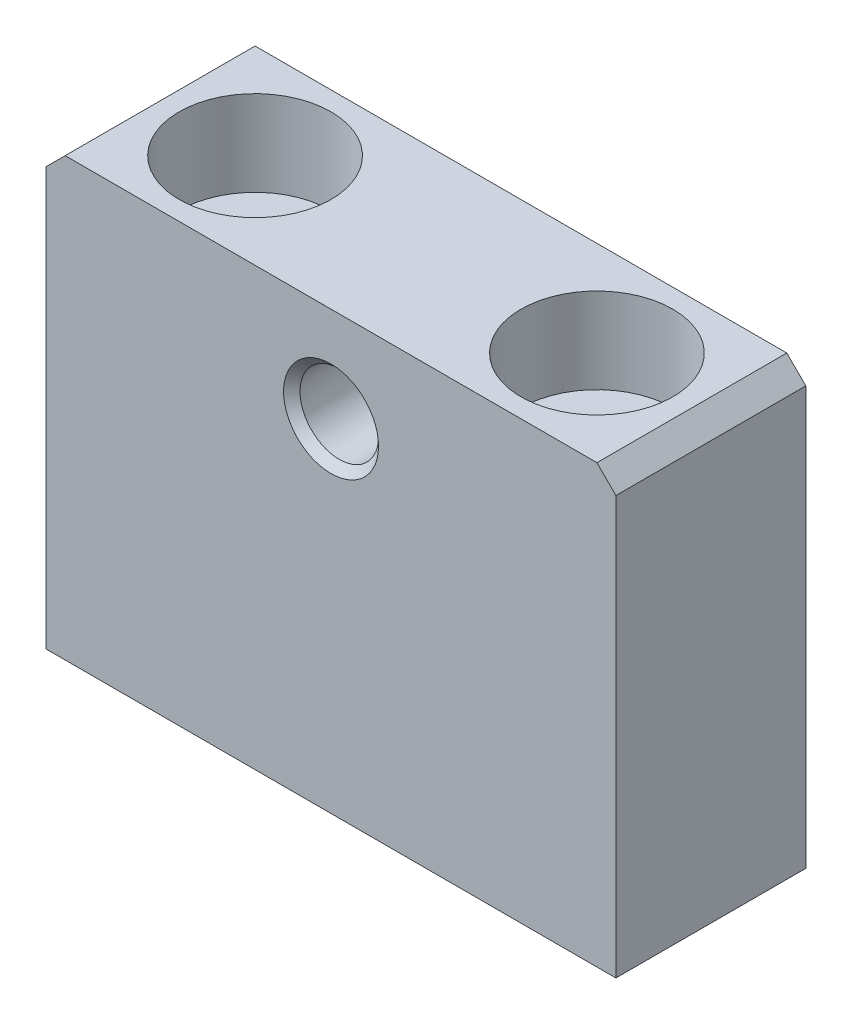
ISO-10303-21;
HEADER;
FILE_DESCRIPTION(('STEP AP214'),'2;1');
FILE_NAME('part.step','',(''),(''),'','','');
FILE_SCHEMA(('AUTOMOTIVE_DESIGN { 1 0 10303 214 1 1 1 1 }'));
ENDSEC;
DATA;
#1=APPLICATION_CONTEXT('core data for automotive mechanical design processes');
#2=APPLICATION_PROTOCOL_DEFINITION('international standard','automotive_design',2000,#1);
#3=PRODUCT_CONTEXT('',#1,'mechanical');
#4=PRODUCT('Part','Part','',(#3));
#5=PRODUCT_RELATED_PRODUCT_CATEGORY('part','',(#4));
#6=PRODUCT_DEFINITION_FORMATION('','',#4);
#7=PRODUCT_DEFINITION_CONTEXT('part definition',#1,'design');
#8=PRODUCT_DEFINITION('design','',#6,#7);
#9=PRODUCT_DEFINITION_SHAPE('','',#8);
#10=(LENGTH_UNIT() NAMED_UNIT(*) SI_UNIT(.MILLI.,.METRE.));
#11=(NAMED_UNIT(*) PLANE_ANGLE_UNIT() SI_UNIT($,.RADIAN.));
#12=(NAMED_UNIT(*) SI_UNIT($,.STERADIAN.) SOLID_ANGLE_UNIT());
#13=UNCERTAINTY_MEASURE_WITH_UNIT(LENGTH_MEASURE(1.E-05),#10,'distance_accuracy_value','');
#14=(GEOMETRIC_REPRESENTATION_CONTEXT(3) GLOBAL_UNCERTAINTY_ASSIGNED_CONTEXT((#13)) GLOBAL_UNIT_ASSIGNED_CONTEXT((#10,
#11,#12)) REPRESENTATION_CONTEXT('',''));
#15=CARTESIAN_POINT('',(0.,0.,0.));
#16=DIRECTION('',(0.,0.,1.));
#17=DIRECTION('',(1.,0.,0.));
#18=AXIS2_PLACEMENT_3D('',#15,#16,#17);
#19=CARTESIAN_POINT('',(-5.875,18.5,0.));
#20=DIRECTION('',(0.,-1.,0.));
#21=DIRECTION('',(0.,0.,-1.));
#22=AXIS2_PLACEMENT_3D('',#19,#20,#21);
#23=PLANE('',#22);
#24=CARTESIAN_POINT('',(-9.,18.5,0.));
#25=DIRECTION('',(0.,-1.,0.));
#26=DIRECTION('',(0.,0.,-1.));
#27=AXIS2_PLACEMENT_3D('',#24,#25,#26);
#28=CIRCLE('',#27,2.25);
#29=CARTESIAN_POINT('',(-9.,18.5,-2.25));
#30=VERTEX_POINT('',#29);
#31=EDGE_CURVE('E20',#30,#30,#28,.T.);
#32=ORIENTED_EDGE('',*,*,#31,.T.);
#33=EDGE_LOOP('',(#32));
#34=FACE_BOUND('',#33,.T.);
#35=CARTESIAN_POINT('',(-9.,18.5,0.));
#36=DIRECTION('',(0.,-1.,0.));
#37=DIRECTION('',(0.,0.,-1.));
#38=AXIS2_PLACEMENT_3D('',#35,#36,#37);
#39=CIRCLE('',#38,4.);
#40=CARTESIAN_POINT('',(-9.,18.5,-4.));
#41=VERTEX_POINT('',#40);
#42=EDGE_CURVE('E129',#41,#41,#39,.F.);
#43=ORIENTED_EDGE('',*,*,#42,.T.);
#44=EDGE_LOOP('',(#43));
#45=FACE_BOUND('',#44,.T.);
#46=ADVANCED_FACE('F17',(#34,#45),#23,.F.);
#47=CARTESIAN_POINT('',(12.125,18.5,0.));
#48=DIRECTION('',(0.,-1.,0.));
#49=DIRECTION('',(0.,0.,-1.));
#50=AXIS2_PLACEMENT_3D('',#47,#48,#49);
#51=PLANE('',#50);
#52=CARTESIAN_POINT('',(9.,18.5,0.));
#53=DIRECTION('',(0.,-1.,0.));
#54=DIRECTION('',(0.,0.,-1.));
#55=AXIS2_PLACEMENT_3D('',#52,#53,#54);
#56=CIRCLE('',#55,2.25);
#57=CARTESIAN_POINT('',(9.,18.5,-2.25));
#58=VERTEX_POINT('',#57);
#59=EDGE_CURVE('E131',#58,#58,#56,.T.);
#60=ORIENTED_EDGE('',*,*,#59,.T.);
#61=EDGE_LOOP('',(#60));
#62=FACE_BOUND('',#61,.T.);
#63=CARTESIAN_POINT('',(9.,18.5,0.));
#64=DIRECTION('',(0.,-1.,0.));
#65=DIRECTION('',(0.,0.,-1.));
#66=AXIS2_PLACEMENT_3D('',#63,#64,#65);
#67=CIRCLE('',#66,4.);
#68=CARTESIAN_POINT('',(9.,18.5,-4.));
#69=VERTEX_POINT('',#68);
#70=EDGE_CURVE('E103',#69,#69,#67,.F.);
#71=ORIENTED_EDGE('',*,*,#70,.T.);
#72=EDGE_LOOP('',(#71));
#73=FACE_BOUND('',#72,.T.);
#74=ADVANCED_FACE('F203',(#62,#73),#51,.F.);
#75=CARTESIAN_POINT('',(0.,18.,-4.99999999993861));
#76=DIRECTION('',(0.,0.,-1.));
#77=DIRECTION('',(-1.,0.,0.));
#78=AXIS2_PLACEMENT_3D('',#75,#76,#77);
#79=CONICAL_SURFACE('',#78,2.4999999998563,0.785398163331809);
#80=CARTESIAN_POINT('',(0.,18.,-4.567));
#81=DIRECTION('',(0.,0.,-1.));
#82=DIRECTION('',(-1.,0.,0.));
#83=AXIS2_PLACEMENT_3D('',#80,#81,#82);
#84=CIRCLE('',#83,2.067);
#85=CARTESIAN_POINT('',(-2.067,18.,-4.567));
#86=VERTEX_POINT('',#85);
#87=EDGE_CURVE('E107',#86,#86,#84,.F.);
#88=ORIENTED_EDGE('',*,*,#87,.T.);
#89=EDGE_LOOP('',(#88));
#90=FACE_BOUND('',#89,.T.);
#91=CARTESIAN_POINT('',(0.,18.,-4.99999999999545));
#92=DIRECTION('',(0.,0.,-1.));
#93=DIRECTION('',(-1.,0.,0.));
#94=AXIS2_PLACEMENT_3D('',#91,#92,#93);
#95=CIRCLE('',#94,2.49999999991314);
#96=CARTESIAN_POINT('',(-2.49999999991314,18.,-4.99999999999545));
#97=VERTEX_POINT('',#96);
#98=EDGE_CURVE('E79',#97,#97,#95,.T.);
#99=ORIENTED_EDGE('',*,*,#98,.T.);
#100=EDGE_LOOP('',(#99));
#101=FACE_BOUND('',#100,.T.);
#102=ADVANCED_FACE('F154',(#90,#101),#79,.F.);
#103=CARTESIAN_POINT('',(0.,18.,0.));
#104=DIRECTION('',(0.,0.,-1.));
#105=DIRECTION('',(-1.,0.,0.));
#106=AXIS2_PLACEMENT_3D('',#103,#104,#105);
#107=CYLINDRICAL_SURFACE('',#106,2.067);
#108=CARTESIAN_POINT('',(0.,18.,4.5669999999518));
#109=DIRECTION('',(0.,0.,1.));
#110=DIRECTION('',(0.,1.,0.));
#111=AXIS2_PLACEMENT_3D('',#108,#109,#110);
#112=CIRCLE('',#111,2.06699999992634);
#113=CARTESIAN_POINT('',(0.,20.0669999999263,4.5669999999518));
#114=VERTEX_POINT('',#113);
#115=EDGE_CURVE('E99',#114,#114,#112,.T.);
#116=ORIENTED_EDGE('',*,*,#115,.T.);
#117=EDGE_LOOP('',(#116));
#118=FACE_BOUND('',#117,.T.);
#119=ORIENTED_EDGE('',*,*,#87,.F.);
#120=EDGE_LOOP('',(#119));
#121=FACE_BOUND('',#120,.T.);
#122=ADVANCED_FACE('F143',(#118,#121),#107,.F.);
#123=CARTESIAN_POINT('',(-9.,9.25,0.));
#124=DIRECTION('',(0.,-1.,0.));
#125=DIRECTION('',(0.,0.,-1.));
#126=AXIS2_PLACEMENT_3D('',#123,#124,#125);
#127=CYLINDRICAL_SURFACE('',#126,2.25);
#128=CARTESIAN_POINT('',(-9.,0.,0.));
#129=DIRECTION('',(0.,-1.,0.));
#130=DIRECTION('',(0.,0.,-1.));
#131=AXIS2_PLACEMENT_3D('',#128,#129,#130);
#132=CIRCLE('',#131,2.25);
#133=CARTESIAN_POINT('',(-9.,0.,-2.25));
#134=VERTEX_POINT('',#133);
#135=EDGE_CURVE('E106',#134,#134,#132,.F.);
#136=ORIENTED_EDGE('',*,*,#135,.F.);
#137=EDGE_LOOP('',(#136));
#138=FACE_BOUND('',#137,.T.);
#139=ORIENTED_EDGE('',*,*,#31,.F.);
#140=EDGE_LOOP('',(#139));
#141=FACE_BOUND('',#140,.T.);
#142=ADVANCED_FACE('F140',(#138,#141),#127,.F.);
#143=CARTESIAN_POINT('',(9.,9.25,0.));
#144=DIRECTION('',(0.,-1.,0.));
#145=DIRECTION('',(0.,0.,-1.));
#146=AXIS2_PLACEMENT_3D('',#143,#144,#145);
#147=CYLINDRICAL_SURFACE('',#146,2.25);
#148=CARTESIAN_POINT('',(9.,0.,0.));
#149=DIRECTION('',(0.,-1.,0.));
#150=DIRECTION('',(0.,0.,-1.));
#151=AXIS2_PLACEMENT_3D('',#148,#149,#150);
#152=CIRCLE('',#151,2.25);
#153=CARTESIAN_POINT('',(9.,0.,-2.25));
#154=VERTEX_POINT('',#153);
#155=EDGE_CURVE('E94',#154,#154,#152,.F.);
#156=ORIENTED_EDGE('',*,*,#155,.F.);
#157=EDGE_LOOP('',(#156));
#158=FACE_BOUND('',#157,.T.);
#159=ORIENTED_EDGE('',*,*,#59,.F.);
#160=EDGE_LOOP('',(#159));
#161=FACE_BOUND('',#160,.T.);
#162=ADVANCED_FACE('F142',(#158,#161),#147,.F.);
#163=CARTESIAN_POINT('',(-9.,20.75,0.));
#164=DIRECTION('',(0.,-1.,0.));
#165=DIRECTION('',(0.,0.,-1.));
#166=AXIS2_PLACEMENT_3D('',#163,#164,#165);
#167=CYLINDRICAL_SURFACE('',#166,4.);
#168=CARTESIAN_POINT('',(-9.,23.,0.));
#169=DIRECTION('',(0.,-1.,0.));
#170=DIRECTION('',(0.,0.,-1.));
#171=AXIS2_PLACEMENT_3D('',#168,#169,#170);
#172=CIRCLE('',#171,4.);
#173=CARTESIAN_POINT('',(-9.,23.,-4.));
#174=VERTEX_POINT('',#173);
#175=EDGE_CURVE('E118',#174,#174,#172,.T.);
#176=ORIENTED_EDGE('',*,*,#175,.F.);
#177=EDGE_LOOP('',(#176));
#178=FACE_BOUND('',#177,.T.);
#179=ORIENTED_EDGE('',*,*,#42,.F.);
#180=EDGE_LOOP('',(#179));
#181=FACE_BOUND('',#180,.T.);
#182=ADVANCED_FACE('F151',(#178,#181),#167,.F.);
#183=CARTESIAN_POINT('',(9.,20.75,0.));
#184=DIRECTION('',(0.,-1.,0.));
#185=DIRECTION('',(0.,0.,-1.));
#186=AXIS2_PLACEMENT_3D('',#183,#184,#185);
#187=CYLINDRICAL_SURFACE('',#186,4.);
#188=CARTESIAN_POINT('',(9.,23.,0.));
#189=DIRECTION('',(0.,-1.,0.));
#190=DIRECTION('',(0.,0.,-1.));
#191=AXIS2_PLACEMENT_3D('',#188,#189,#190);
#192=CIRCLE('',#191,4.);
#193=CARTESIAN_POINT('',(9.,23.,-4.));
#194=VERTEX_POINT('',#193);
#195=EDGE_CURVE('E115',#194,#194,#192,.T.);
#196=ORIENTED_EDGE('',*,*,#195,.F.);
#197=EDGE_LOOP('',(#196));
#198=FACE_BOUND('',#197,.T.);
#199=ORIENTED_EDGE('',*,*,#70,.F.);
#200=EDGE_LOOP('',(#199));
#201=FACE_BOUND('',#200,.T.);
#202=ADVANCED_FACE('F191',(#198,#201),#187,.F.);
#203=CARTESIAN_POINT('',(15.,22.,5.));
#204=DIRECTION('',(0.707106781186548,0.707106781186548,0.));
#205=DIRECTION('',(-0.707106781186548,0.707106781186548,0.));
#206=AXIS2_PLACEMENT_3D('',#203,#204,#205);
#207=PLANE('',#206);
#208=DIRECTION('',(-0.707106781186548,0.707106781186548,0.));
#209=VECTOR('',#208,1.);
#210=CARTESIAN_POINT('',(15.,22.,5.));
#211=LINE('',#210,#209);
#212=CARTESIAN_POINT('',(14.,23.,5.));
#213=VERTEX_POINT('',#212);
#214=CARTESIAN_POINT('',(15.,22.,5.));
#215=VERTEX_POINT('',#214);
#216=EDGE_CURVE('E84',#213,#215,#211,.F.);
#217=ORIENTED_EDGE('',*,*,#216,.T.);
#218=DIRECTION('',(0.,0.,-1.));
#219=VECTOR('',#218,1.);
#220=CARTESIAN_POINT('',(15.,22.,5.));
#221=LINE('',#220,#219);
#222=CARTESIAN_POINT('',(15.,22.,-5.));
#223=VERTEX_POINT('',#222);
#224=EDGE_CURVE('E82',#223,#215,#221,.F.);
#225=ORIENTED_EDGE('',*,*,#224,.F.);
#226=DIRECTION('',(-0.707106781186547,0.707106781186548,0.));
#227=VECTOR('',#226,1.);
#228=CARTESIAN_POINT('',(15.,22.,-5.));
#229=LINE('',#228,#227);
#230=CARTESIAN_POINT('',(14.,23.,-5.));
#231=VERTEX_POINT('',#230);
#232=EDGE_CURVE('E69',#223,#231,#229,.T.);
#233=ORIENTED_EDGE('',*,*,#232,.T.);
#234=DIRECTION('',(0.,0.,1.));
#235=VECTOR('',#234,1.);
#236=CARTESIAN_POINT('',(14.,23.,5.));
#237=LINE('',#236,#235);
#238=EDGE_CURVE('E393',#213,#231,#237,.F.);
#239=ORIENTED_EDGE('',*,*,#238,.F.);
#240=EDGE_LOOP('',(#217,#225,#233,#239));
#241=FACE_BOUND('',#240,.T.);
#242=ADVANCED_FACE('F83',(#241),#207,.T.);
#243=CARTESIAN_POINT('',(0.,0.,-5.));
#244=DIRECTION('',(0.,0.,1.));
#245=DIRECTION('',(1.,0.,0.));
#246=AXIS2_PLACEMENT_3D('',#243,#244,#245);
#247=PLANE('',#246);
#248=DIRECTION('',(1.,0.,0.));
#249=VECTOR('',#248,1.);
#250=CARTESIAN_POINT('',(-15.,0.,-5.));
#251=LINE('',#250,#249);
#252=CARTESIAN_POINT('',(-15.,0.,-5.));
#253=VERTEX_POINT('',#252);
#254=CARTESIAN_POINT('',(15.,0.,-5.));
#255=VERTEX_POINT('',#254);
#256=EDGE_CURVE('E92',#253,#255,#251,.T.);
#257=ORIENTED_EDGE('',*,*,#256,.F.);
#258=DIRECTION('',(0.,1.,0.));
#259=VECTOR('',#258,1.);
#260=CARTESIAN_POINT('',(-15.,22.,-5.));
#261=LINE('',#260,#259);
#262=CARTESIAN_POINT('',(-15.,22.,-5.));
#263=VERTEX_POINT('',#262);
#264=EDGE_CURVE('E405',#263,#253,#261,.F.);
#265=ORIENTED_EDGE('',*,*,#264,.F.);
#266=DIRECTION('',(-0.707106781186548,-0.707106781186548,0.));
#267=VECTOR('',#266,1.);
#268=CARTESIAN_POINT('',(-14.,23.,-5.));
#269=LINE('',#268,#267);
#270=CARTESIAN_POINT('',(-14.,23.,-5.));
#271=VERTEX_POINT('',#270);
#272=EDGE_CURVE('E78',#271,#263,#269,.T.);
#273=ORIENTED_EDGE('',*,*,#272,.F.);
#274=DIRECTION('',(1.,0.,0.));
#275=VECTOR('',#274,1.);
#276=CARTESIAN_POINT('',(14.,23.,-5.));
#277=LINE('',#276,#275);
#278=EDGE_CURVE('E74',#231,#271,#277,.F.);
#279=ORIENTED_EDGE('',*,*,#278,.F.);
#280=ORIENTED_EDGE('',*,*,#232,.F.);
#281=DIRECTION('',(0.,1.,0.));
#282=VECTOR('',#281,1.);
#283=CARTESIAN_POINT('',(15.,0.,-5.));
#284=LINE('',#283,#282);
#285=EDGE_CURVE('E66',#255,#223,#284,.T.);
#286=ORIENTED_EDGE('',*,*,#285,.F.);
#287=EDGE_LOOP('',(#257,#265,#273,#279,#280,#286));
#288=FACE_BOUND('',#287,.T.);
#289=ORIENTED_EDGE('',*,*,#98,.F.);
#290=EDGE_LOOP('',(#289));
#291=FACE_BOUND('',#290,.T.);
#292=ADVANCED_FACE('F71',(#288,#291),#247,.F.);
#293=CARTESIAN_POINT('',(-14.,23.,5.));
#294=DIRECTION('',(-0.707106781186548,0.707106781186548,0.));
#295=DIRECTION('',(-0.707106781186548,-0.707106781186548,0.));
#296=AXIS2_PLACEMENT_3D('',#293,#294,#295);
#297=PLANE('',#296);
#298=DIRECTION('',(-0.707106781186548,-0.707106781186548,0.));
#299=VECTOR('',#298,1.);
#300=CARTESIAN_POINT('',(-14.,23.,5.));
#301=LINE('',#300,#299);
#302=CARTESIAN_POINT('',(-15.,22.,5.));
#303=VERTEX_POINT('',#302);
#304=CARTESIAN_POINT('',(-14.,23.,5.));
#305=VERTEX_POINT('',#304);
#306=EDGE_CURVE('E34',#303,#305,#301,.F.);
#307=ORIENTED_EDGE('',*,*,#306,.T.);
#308=DIRECTION('',(0.,0.,1.));
#309=VECTOR('',#308,1.);
#310=CARTESIAN_POINT('',(-14.,23.,5.));
#311=LINE('',#310,#309);
#312=EDGE_CURVE('E389',#271,#305,#311,.T.);
#313=ORIENTED_EDGE('',*,*,#312,.F.);
#314=ORIENTED_EDGE('',*,*,#272,.T.);
#315=DIRECTION('',(0.,0.,1.));
#316=VECTOR('',#315,1.);
#317=CARTESIAN_POINT('',(-15.,22.,5.));
#318=LINE('',#317,#316);
#319=EDGE_CURVE('E114',#303,#263,#318,.F.);
#320=ORIENTED_EDGE('',*,*,#319,.F.);
#321=EDGE_LOOP('',(#307,#313,#314,#320));
#322=FACE_BOUND('',#321,.T.);
#323=ADVANCED_FACE('F182',(#322),#297,.T.);
#324=CARTESIAN_POINT('',(0.,18.,4.99999999993861));
#325=DIRECTION('',(0.,0.,1.));
#326=DIRECTION('',(1.,0.,0.));
#327=AXIS2_PLACEMENT_3D('',#324,#325,#326);
#328=CONICAL_SURFACE('',#327,2.4999999998563,0.785398163331809);
#329=CARTESIAN_POINT('',(0.,18.,4.99999999999545));
#330=DIRECTION('',(0.,0.,1.));
#331=DIRECTION('',(1.,0.,0.));
#332=AXIS2_PLACEMENT_3D('',#329,#330,#331);
#333=CIRCLE('',#332,2.49999999991314);
#334=CARTESIAN_POINT('',(2.49999999991314,18.,4.99999999999545));
#335=VERTEX_POINT('',#334);
#336=EDGE_CURVE('E110',#335,#335,#333,.F.);
#337=ORIENTED_EDGE('',*,*,#336,.F.);
#338=EDGE_LOOP('',(#337));
#339=FACE_BOUND('',#338,.T.);
#340=ORIENTED_EDGE('',*,*,#115,.F.);
#341=EDGE_LOOP('',(#340));
#342=FACE_BOUND('',#341,.T.);
#343=ADVANCED_FACE('F178',(#339,#342),#328,.F.);
#344=CARTESIAN_POINT('',(-15.,0.,5.));
#345=DIRECTION('',(0.,-1.,0.));
#346=DIRECTION('',(0.,0.,-1.));
#347=AXIS2_PLACEMENT_3D('',#344,#345,#346);
#348=PLANE('',#347);
#349=DIRECTION('',(1.,0.,0.));
#350=VECTOR('',#349,1.);
#351=CARTESIAN_POINT('',(0.,0.,5.));
#352=LINE('',#351,#350);
#353=CARTESIAN_POINT('',(-15.,0.,5.));
#354=VERTEX_POINT('',#353);
#355=CARTESIAN_POINT('',(15.,0.,5.));
#356=VERTEX_POINT('',#355);
#357=EDGE_CURVE('E113',#354,#356,#352,.T.);
#358=ORIENTED_EDGE('',*,*,#357,.F.);
#359=DIRECTION('',(0.,0.,1.));
#360=VECTOR('',#359,1.);
#361=CARTESIAN_POINT('',(-15.,0.,5.));
#362=LINE('',#361,#360);
#363=EDGE_CURVE('E402',#253,#354,#362,.T.);
#364=ORIENTED_EDGE('',*,*,#363,.F.);
#365=ORIENTED_EDGE('',*,*,#256,.T.);
#366=DIRECTION('',(0.,0.,-1.));
#367=VECTOR('',#366,1.);
#368=CARTESIAN_POINT('',(15.,0.,5.));
#369=LINE('',#368,#367);
#370=EDGE_CURVE('E88',#356,#255,#369,.T.);
#371=ORIENTED_EDGE('',*,*,#370,.F.);
#372=EDGE_LOOP('',(#358,#364,#365,#371));
#373=FACE_BOUND('',#372,.T.);
#374=ORIENTED_EDGE('',*,*,#155,.T.);
#375=EDGE_LOOP('',(#374));
#376=FACE_BOUND('',#375,.T.);
#377=ORIENTED_EDGE('',*,*,#135,.T.);
#378=EDGE_LOOP('',(#377));
#379=FACE_BOUND('',#378,.T.);
#380=ADVANCED_FACE('F175',(#373,#376,#379),#348,.T.);
#381=CARTESIAN_POINT('',(15.,0.,5.));
#382=DIRECTION('',(1.,0.,0.));
#383=DIRECTION('',(0.,0.,-1.));
#384=AXIS2_PLACEMENT_3D('',#381,#382,#383);
#385=PLANE('',#384);
#386=DIRECTION('',(0.,1.,0.));
#387=VECTOR('',#386,1.);
#388=CARTESIAN_POINT('',(15.,0.,5.));
#389=LINE('',#388,#387);
#390=EDGE_CURVE('E395',#356,#215,#389,.T.);
#391=ORIENTED_EDGE('',*,*,#390,.F.);
#392=ORIENTED_EDGE('',*,*,#370,.T.);
#393=ORIENTED_EDGE('',*,*,#285,.T.);
#394=ORIENTED_EDGE('',*,*,#224,.T.);
#395=EDGE_LOOP('',(#391,#392,#393,#394));
#396=FACE_BOUND('',#395,.T.);
#397=ADVANCED_FACE('F91',(#396),#385,.T.);
#398=CARTESIAN_POINT('',(14.,23.,5.));
#399=DIRECTION('',(0.,1.,0.));
#400=DIRECTION('',(0.,0.,1.));
#401=AXIS2_PLACEMENT_3D('',#398,#399,#400);
#402=PLANE('',#401);
#403=DIRECTION('',(1.,0.,0.));
#404=VECTOR('',#403,1.);
#405=CARTESIAN_POINT('',(0.,23.,5.));
#406=LINE('',#405,#404);
#407=EDGE_CURVE('E26',#213,#305,#406,.F.);
#408=ORIENTED_EDGE('',*,*,#407,.F.);
#409=ORIENTED_EDGE('',*,*,#238,.T.);
#410=ORIENTED_EDGE('',*,*,#278,.T.);
#411=ORIENTED_EDGE('',*,*,#312,.T.);
#412=EDGE_LOOP('',(#408,#409,#410,#411));
#413=FACE_BOUND('',#412,.T.);
#414=ORIENTED_EDGE('',*,*,#195,.T.);
#415=EDGE_LOOP('',(#414));
#416=FACE_BOUND('',#415,.T.);
#417=ORIENTED_EDGE('',*,*,#175,.T.);
#418=EDGE_LOOP('',(#417));
#419=FACE_BOUND('',#418,.T.);
#420=ADVANCED_FACE('F165',(#413,#416,#419),#402,.T.);
#421=CARTESIAN_POINT('',(-15.,22.,5.));
#422=DIRECTION('',(-1.,0.,0.));
#423=DIRECTION('',(0.,0.,1.));
#424=AXIS2_PLACEMENT_3D('',#421,#422,#423);
#425=PLANE('',#424);
#426=DIRECTION('',(0.,1.,0.));
#427=VECTOR('',#426,1.);
#428=CARTESIAN_POINT('',(-15.,0.,5.));
#429=LINE('',#428,#427);
#430=EDGE_CURVE('E11',#303,#354,#429,.F.);
#431=ORIENTED_EDGE('',*,*,#430,.F.);
#432=ORIENTED_EDGE('',*,*,#319,.T.);
#433=ORIENTED_EDGE('',*,*,#264,.T.);
#434=ORIENTED_EDGE('',*,*,#363,.T.);
#435=EDGE_LOOP('',(#431,#432,#433,#434));
#436=FACE_BOUND('',#435,.T.);
#437=ADVANCED_FACE('F160',(#436),#425,.T.);
#438=CARTESIAN_POINT('',(0.,0.,5.));
#439=DIRECTION('',(0.,0.,1.));
#440=DIRECTION('',(1.,0.,0.));
#441=AXIS2_PLACEMENT_3D('',#438,#439,#440);
#442=PLANE('',#441);
#443=ORIENTED_EDGE('',*,*,#306,.F.);
#444=ORIENTED_EDGE('',*,*,#430,.T.);
#445=ORIENTED_EDGE('',*,*,#357,.T.);
#446=ORIENTED_EDGE('',*,*,#390,.T.);
#447=ORIENTED_EDGE('',*,*,#216,.F.);
#448=ORIENTED_EDGE('',*,*,#407,.T.);
#449=EDGE_LOOP('',(#443,#444,#445,#446,#447,#448));
#450=FACE_BOUND('',#449,.T.);
#451=ORIENTED_EDGE('',*,*,#336,.T.);
#452=EDGE_LOOP('',(#451));
#453=FACE_BOUND('',#452,.T.);
#454=ADVANCED_FACE('F158',(#450,#453),#442,.T.);
#455=CLOSED_SHELL('',(#46,#74,#102,#122,#142,#162,#182,#202,#242,#292,#323,#343,#380,#397,#420,
#437,#454));
#456=MANIFOLD_SOLID_BREP('B1',#455);
#457=ADVANCED_BREP_SHAPE_REPRESENTATION('',(#18,#456),#14);
#458=SHAPE_DEFINITION_REPRESENTATION(#9,#457);
ENDSEC;
END-ISO-10303-21;
